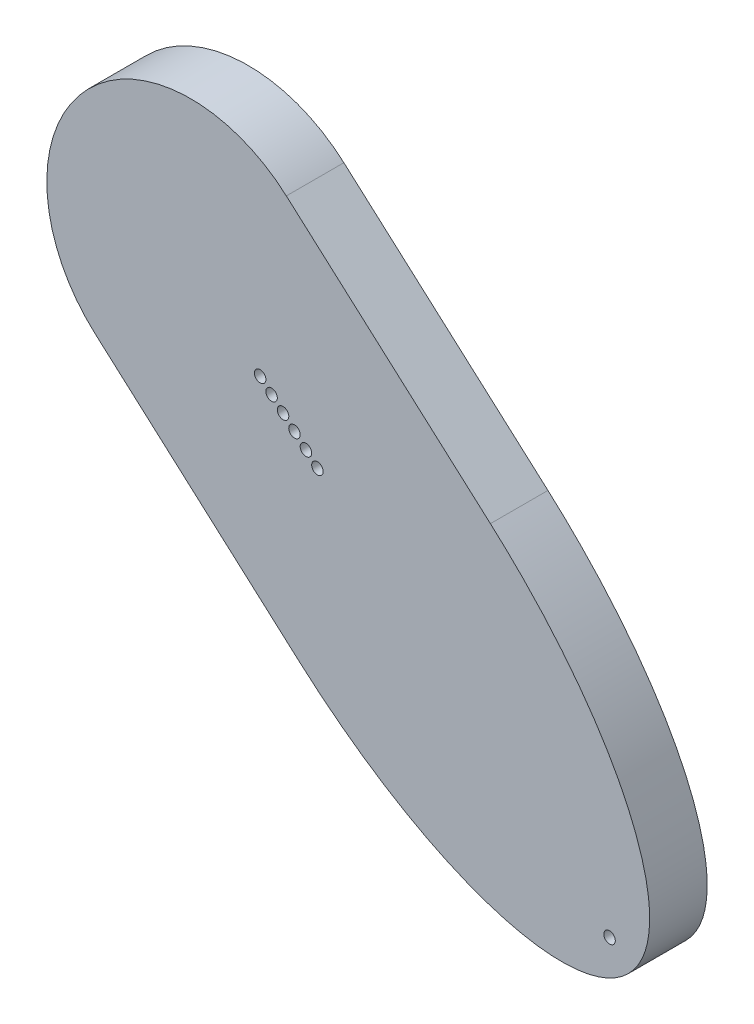
ISO-10303-21;
HEADER;
FILE_DESCRIPTION(('STEP AP214'),'2;1');
FILE_NAME('part.step','',(''),(''),'','','');
FILE_SCHEMA(('AUTOMOTIVE_DESIGN { 1 0 10303 214 1 1 1 1 }'));
ENDSEC;
DATA;
#1=APPLICATION_CONTEXT('core data for automotive mechanical design processes');
#2=APPLICATION_PROTOCOL_DEFINITION('international standard','automotive_design',2000,#1);
#3=PRODUCT_CONTEXT('',#1,'mechanical');
#4=PRODUCT('Part','Part','',(#3));
#5=PRODUCT_RELATED_PRODUCT_CATEGORY('part','',(#4));
#6=PRODUCT_DEFINITION_FORMATION('','',#4);
#7=PRODUCT_DEFINITION_CONTEXT('part definition',#1,'design');
#8=PRODUCT_DEFINITION('design','',#6,#7);
#9=PRODUCT_DEFINITION_SHAPE('','',#8);
#10=(LENGTH_UNIT() NAMED_UNIT(*) SI_UNIT(.MILLI.,.METRE.));
#11=(NAMED_UNIT(*) PLANE_ANGLE_UNIT() SI_UNIT($,.RADIAN.));
#12=(NAMED_UNIT(*) SI_UNIT($,.STERADIAN.) SOLID_ANGLE_UNIT());
#13=UNCERTAINTY_MEASURE_WITH_UNIT(LENGTH_MEASURE(1.E-05),#10,'distance_accuracy_value','');
#14=(GEOMETRIC_REPRESENTATION_CONTEXT(3) GLOBAL_UNCERTAINTY_ASSIGNED_CONTEXT((#13)) GLOBAL_UNIT_ASSIGNED_CONTEXT((#10,
#11,#12)) REPRESENTATION_CONTEXT('',''));
#15=CARTESIAN_POINT('',(0.,0.,0.));
#16=DIRECTION('',(0.,0.,1.));
#17=DIRECTION('',(1.,0.,0.));
#18=AXIS2_PLACEMENT_3D('',#15,#16,#17);
#19=CARTESIAN_POINT('',(0.,0.,-20.));
#20=DIRECTION('',(0.,0.,1.));
#21=DIRECTION('',(1.,0.,0.));
#22=AXIS2_PLACEMENT_3D('',#19,#20,#21);
#23=PLANE('',#22);
#24=CARTESIAN_POINT('',(16.0543335775935,-14.3004920680847,-20.));
#25=DIRECTION('',(0.,0.,-1.));
#26=DIRECTION('',(-1.,0.,0.));
#27=AXIS2_PLACEMENT_3D('',#24,#25,#26);
#28=CIRCLE('',#27,0.999999999999997);
#29=CARTESIAN_POINT('',(15.0543335775935,-14.3004920680847,-20.));
#30=VERTEX_POINT('',#29);
#31=EDGE_CURVE('E721',#30,#30,#28,.T.);
#32=ORIENTED_EDGE('',*,*,#31,.F.);
#33=EDGE_LOOP('',(#32));
#34=FACE_BOUND('',#33,.T.);
#35=CARTESIAN_POINT('',(18.0456029021656,-16.074226931873,-20.));
#36=DIRECTION('',(0.,0.,-1.));
#37=DIRECTION('',(-1.,0.,0.));
#38=AXIS2_PLACEMENT_3D('',#35,#36,#37);
#39=CIRCLE('',#38,0.999999999999998);
#40=CARTESIAN_POINT('',(17.0456029021656,-16.074226931873,-20.));
#41=VERTEX_POINT('',#40);
#42=EDGE_CURVE('E732',#41,#41,#39,.T.);
#43=ORIENTED_EDGE('',*,*,#42,.F.);
#44=EDGE_LOOP('',(#43));
#45=FACE_BOUND('',#44,.T.);
#46=CARTESIAN_POINT('',(22.0281415513099,-19.6216966594495,-20.));
#47=DIRECTION('',(0.,0.,-1.));
#48=DIRECTION('',(-1.,0.,0.));
#49=AXIS2_PLACEMENT_3D('',#46,#47,#48);
#50=CIRCLE('',#49,1.);
#51=CARTESIAN_POINT('',(21.0281415513099,-19.6216966594495,-20.));
#52=VERTEX_POINT('',#51);
#53=EDGE_CURVE('E509',#52,#52,#50,.T.);
#54=ORIENTED_EDGE('',*,*,#53,.F.);
#55=EDGE_LOOP('',(#54));
#56=FACE_BOUND('',#55,.T.);
#57=CARTESIAN_POINT('',(12.0717949284492,-10.7530223405082,-20.));
#58=DIRECTION('',(0.,0.,-1.));
#59=DIRECTION('',(-1.,0.,0.));
#60=AXIS2_PLACEMENT_3D('',#57,#58,#59);
#61=CIRCLE('',#60,0.999999999999994);
#62=CARTESIAN_POINT('',(11.0717949284492,-10.7530223405082,-20.));
#63=VERTEX_POINT('',#62);
#64=EDGE_CURVE('E723',#63,#63,#61,.T.);
#65=ORIENTED_EDGE('',*,*,#64,.F.);
#66=EDGE_LOOP('',(#65));
#67=FACE_BOUND('',#66,.T.);
#68=CARTESIAN_POINT('',(20.0368722267378,-17.8479617956613,-20.));
#69=DIRECTION('',(0.,0.,-1.));
#70=DIRECTION('',(-1.,0.,0.));
#71=AXIS2_PLACEMENT_3D('',#68,#69,#70);
#72=CIRCLE('',#71,1.);
#73=CARTESIAN_POINT('',(19.0368722267378,-17.8479617956613,-20.));
#74=VERTEX_POINT('',#73);
#75=EDGE_CURVE('E506',#74,#74,#72,.T.);
#76=ORIENTED_EDGE('',*,*,#75,.F.);
#77=EDGE_LOOP('',(#76));
#78=FACE_BOUND('',#77,.T.);
#79=DIRECTION('',(-0.683430900894076,0.730015207857419,0.));
#80=VECTOR('',#79,1.);
#81=CARTESIAN_POINT('',(5.08912030286319,4.76436933903359,-20.));
#82=LINE('',#81,#80);
#83=CARTESIAN_POINT('',(23.527848394188,-14.9311871577616,-20.));
#84=VERTEX_POINT('',#83);
#85=CARTESIAN_POINT('',(14.1661952154149,-4.93142100400631,-20.));
#86=VERTEX_POINT('',#85);
#87=EDGE_CURVE('E429',#84,#86,#82,.T.);
#88=ORIENTED_EDGE('',*,*,#87,.F.);
#89=CARTESIAN_POINT('',(20.5347082257974,-18.2914121401648,-20.));
#90=DIRECTION('',(0.,0.,-1.));
#91=DIRECTION('',(-1.,0.,0.));
#92=AXIS2_PLACEMENT_3D('',#89,#90,#91);
#93=CIRCLE('',#92,4.5);
#94=CARTESIAN_POINT('',(17.5415680574068,-21.651637122568,-20.));
#95=VERTEX_POINT('',#94);
#96=EDGE_CURVE('E423',#84,#95,#93,.T.);
#97=ORIENTED_EDGE('',*,*,#96,.T.);
#98=DIRECTION('',(0.803869202296331,-0.594806107567383,0.));
#99=VECTOR('',#98,1.);
#100=CARTESIAN_POINT('',(-4.14654353184298,-5.6039751421887,-20.));
#101=LINE('',#100,#99);
#102=CARTESIAN_POINT('',(6.53014808334627,-13.5039685281612,-20.));
#103=VERTEX_POINT('',#102);
#104=EDGE_CURVE('E281',#103,#95,#101,.T.);
#105=ORIENTED_EDGE('',*,*,#104,.F.);
#106=CARTESIAN_POINT('',(0.,0.,-20.));
#107=DIRECTION('',(0.,0.,-1.));
#108=DIRECTION('',(-1.,0.,0.));
#109=AXIS2_PLACEMENT_3D('',#106,#107,#108);
#110=CIRCLE('',#109,15.);
#111=CARTESIAN_POINT('',(6.27996634254836,-13.6221152078691,-20.));
#112=VERTEX_POINT('',#111);
#113=EDGE_CURVE('E445',#103,#112,#110,.T.);
#114=ORIENTED_EDGE('',*,*,#113,.T.);
#115=CARTESIAN_POINT('',(20.5347082257974,-18.2914121401648,-20.));
#116=DIRECTION('',(0.,0.,-1.));
#117=DIRECTION('',(-1.,0.,0.));
#118=AXIS2_PLACEMENT_3D('',#115,#116,#117);
#119=CIRCLE('',#118,15.);
#120=CARTESIAN_POINT('',(6.36177647907124,-13.3793855011245,-20.));
#121=VERTEX_POINT('',#120);
#122=EDGE_CURVE('E443',#112,#121,#119,.T.);
#123=ORIENTED_EDGE('',*,*,#122,.T.);
#124=DIRECTION('',(0.803869202296331,-0.594806107567383,0.));
#125=VECTOR('',#124,1.);
#126=CARTESIAN_POINT('',(-4.14654353184298,-5.6039751421887,-20.));
#127=LINE('',#126,#125);
#128=CARTESIAN_POINT('',(-3.63709124618949,-5.9809336450835,-20.));
#129=VERTEX_POINT('',#128);
#130=EDGE_CURVE('E440',#129,#121,#127,.T.);
#131=ORIENTED_EDGE('',*,*,#130,.F.);
#132=CARTESIAN_POINT('',(0.,0.,-20.));
#133=DIRECTION('',(0.,0.,-1.));
#134=DIRECTION('',(-1.,0.,0.));
#135=AXIS2_PLACEMENT_3D('',#132,#133,#134);
#136=CIRCLE('',#135,7.);
#137=CARTESIAN_POINT('',(5.5222447882299,4.30172203877328,-20.));
#138=VERTEX_POINT('',#137);
#139=EDGE_CURVE('E438',#129,#138,#136,.T.);
#140=ORIENTED_EDGE('',*,*,#139,.T.);
#141=DIRECTION('',(-0.683430900894076,0.730015207857419,0.));
#142=VECTOR('',#141,1.);
#143=CARTESIAN_POINT('',(5.08912030286319,4.76436933903359,-20.));
#144=LINE('',#143,#142);
#145=CARTESIAN_POINT('',(14.0230495931347,-4.77851822910088,-20.));
#146=VERTEX_POINT('',#145);
#147=EDGE_CURVE('E435',#146,#138,#144,.T.);
#148=ORIENTED_EDGE('',*,*,#147,.F.);
#149=CARTESIAN_POINT('',(20.5347082257974,-18.2914121401648,-20.));
#150=DIRECTION('',(0.,0.,-1.));
#151=DIRECTION('',(-1.,0.,0.));
#152=AXIS2_PLACEMENT_3D('',#149,#150,#151);
#153=CIRCLE('',#152,15.);
#154=CARTESIAN_POINT('',(14.254741883249,-4.66929693229568,-20.));
#155=VERTEX_POINT('',#154);
#156=EDGE_CURVE('E433',#146,#155,#153,.T.);
#157=ORIENTED_EDGE('',*,*,#156,.T.);
#158=CARTESIAN_POINT('',(0.,0.,-20.));
#159=DIRECTION('',(0.,0.,-1.));
#160=DIRECTION('',(-1.,0.,0.));
#161=AXIS2_PLACEMENT_3D('',#158,#159,#160);
#162=CIRCLE('',#161,15.);
#163=EDGE_CURVE('E431',#155,#86,#162,.T.);
#164=ORIENTED_EDGE('',*,*,#163,.T.);
#165=EDGE_LOOP('',(#88,#97,#105,#114,#123,#131,#140,#148,#157,#164));
#166=FACE_BOUND('',#165,.T.);
#167=CARTESIAN_POINT('',(14.0630642530214,-12.5267572042964,-20.));
#168=DIRECTION('',(0.,0.,-1.));
#169=DIRECTION('',(-1.,0.,0.));
#170=AXIS2_PLACEMENT_3D('',#167,#168,#169);
#171=CIRCLE('',#170,0.999999999999995);
#172=CARTESIAN_POINT('',(13.0630642530214,-12.5267572042964,-20.));
#173=VERTEX_POINT('',#172);
#174=EDGE_CURVE('E719',#173,#173,#171,.T.);
#175=ORIENTED_EDGE('',*,*,#174,.F.);
#176=EDGE_LOOP('',(#175));
#177=FACE_BOUND('',#176,.T.);
#178=ADVANCED_FACE('F135',(#34,#45,#56,#67,#78,#166,#177),#23,.F.);
#179=CARTESIAN_POINT('',(35.4690414809228,-31.594257333012,-20.));
#180=DIRECTION('',(0.,0.,1.));
#181=DIRECTION('',(-0.746716662756269,0.665142259642357,0.));
#182=AXIS2_PLACEMENT_3D('',#179,#180,#181);
#183=ELLIPSE('',#182,55.,25.);
#184=CARTESIAN_POINT('',(18.8404849898639,-50.2621739019187,-20.));
#185=VERTEX_POINT('',#184);
#186=CARTESIAN_POINT('',(52.0975979719817,-12.9263407641053,-20.));
#187=VERTEX_POINT('',#186);
#188=EDGE_CURVE('E297',#185,#187,#183,.T.);
#189=ORIENTED_EDGE('',*,*,#188,.F.);
#190=DIRECTION('',(0.746716662756269,-0.665142259642357,0.));
#191=VECTOR('',#190,1.);
#192=CARTESIAN_POINT('',(-16.6285564910589,-18.6679165689067,-20.));
#193=LINE('',#192,#191);
#194=CARTESIAN_POINT('',(-16.6285564910589,-18.6679165689067,-20.));
#195=VERTEX_POINT('',#194);
#196=EDGE_CURVE('E389',#195,#185,#193,.T.);
#197=ORIENTED_EDGE('',*,*,#196,.F.);
#198=CARTESIAN_POINT('',(0.,0.,-20.));
#199=DIRECTION('',(0.,0.,1.));
#200=DIRECTION('',(1.,0.,0.));
#201=AXIS2_PLACEMENT_3D('',#198,#199,#200);
#202=CIRCLE('',#201,25.);
#203=CARTESIAN_POINT('',(16.6285564910589,18.6679165689067,-20.));
#204=VERTEX_POINT('',#203);
#205=EDGE_CURVE('E386',#204,#195,#202,.T.);
#206=ORIENTED_EDGE('',*,*,#205,.F.);
#207=DIRECTION('',(0.746716662756268,-0.665142259642358,0.));
#208=VECTOR('',#207,1.);
#209=CARTESIAN_POINT('',(16.6285564910589,18.6679165689067,-20.));
#210=LINE('',#209,#208);
#211=EDGE_CURVE('E394',#204,#187,#210,.T.);
#212=ORIENTED_EDGE('',*,*,#211,.T.);
#213=EDGE_LOOP('',(#189,#197,#206,#212));
#214=FACE_BOUND('',#213,.T.);
#215=CARTESIAN_POINT('',(72.8048746187362,-64.8513703151298,-20.));
#216=DIRECTION('',(0.,0.,1.));
#217=DIRECTION('',(1.,0.,0.));
#218=AXIS2_PLACEMENT_3D('',#215,#216,#217);
#219=CIRCLE('',#218,1.00000000000001);
#220=CARTESIAN_POINT('',(73.8048746187362,-64.8513703151298,-20.));
#221=VERTEX_POINT('',#220);
#222=EDGE_CURVE('E12',#221,#221,#219,.T.);
#223=ORIENTED_EDGE('',*,*,#222,.T.);
#224=EDGE_LOOP('',(#223));
#225=FACE_BOUND('',#224,.T.);
#226=DIRECTION('',(-0.746716662756269,0.665142259642357,0.));
#227=VECTOR('',#226,1.);
#228=CARTESIAN_POINT('',(-9.97713389463536,-11.200749941344,-20.));
#229=LINE('',#228,#227);
#230=CARTESIAN_POINT('',(10.557574331162,-29.4921620815089,-20.));
#231=VERTEX_POINT('',#230);
#232=CARTESIAN_POINT('',(-9.97713389463536,-11.200749941344,-20.));
#233=VERTEX_POINT('',#232);
#234=EDGE_CURVE('E284',#231,#233,#229,.T.);
#235=ORIENTED_EDGE('',*,*,#234,.F.);
#236=CARTESIAN_POINT('',(20.5347082257974,-18.2914121401648,-20.));
#237=DIRECTION('',(0.,0.,-1.));
#238=DIRECTION('',(-1.,0.,0.));
#239=AXIS2_PLACEMENT_3D('',#236,#237,#238);
#240=CIRCLE('',#239,15.);
#241=CARTESIAN_POINT('',(30.5118421204327,-7.09066219882079,-20.));
#242=VERTEX_POINT('',#241);
#243=EDGE_CURVE('E419',#242,#231,#240,.T.);
#244=ORIENTED_EDGE('',*,*,#243,.F.);
#245=DIRECTION('',(-0.746716662756269,0.665142259642357,0.));
#246=VECTOR('',#245,1.);
#247=CARTESIAN_POINT('',(9.97713389463537,11.200749941344,-20.));
#248=LINE('',#247,#246);
#249=CARTESIAN_POINT('',(9.97713389463537,11.200749941344,-20.));
#250=VERTEX_POINT('',#249);
#251=EDGE_CURVE('E157',#242,#250,#248,.T.);
#252=ORIENTED_EDGE('',*,*,#251,.T.);
#253=CARTESIAN_POINT('',(0.,0.,-20.));
#254=DIRECTION('',(0.,0.,-1.));
#255=DIRECTION('',(-1.,0.,0.));
#256=AXIS2_PLACEMENT_3D('',#253,#254,#255);
#257=CIRCLE('',#256,15.);
#258=EDGE_CURVE('E152',#233,#250,#257,.T.);
#259=ORIENTED_EDGE('',*,*,#258,.F.);
#260=EDGE_LOOP('',(#235,#244,#252,#259));
#261=FACE_BOUND('',#260,.T.);
#262=ADVANCED_FACE('F329',(#214,#225,#261),#23,.F.);
#263=CARTESIAN_POINT('',(0.,0.,-10.));
#264=DIRECTION('',(0.,0.,1.));
#265=DIRECTION('',(1.,0.,0.));
#266=AXIS2_PLACEMENT_3D('',#263,#264,#265);
#267=PLANE('',#266);
#268=CARTESIAN_POINT('',(16.0543335775935,-14.3004920680847,-10.));
#269=DIRECTION('',(0.,0.,-1.));
#270=DIRECTION('',(-1.,0.,0.));
#271=AXIS2_PLACEMENT_3D('',#268,#269,#270);
#272=CIRCLE('',#271,0.999999999999997);
#273=CARTESIAN_POINT('',(15.0543335775935,-14.3004920680847,-10.));
#274=VERTEX_POINT('',#273);
#275=EDGE_CURVE('E347',#274,#274,#272,.T.);
#276=ORIENTED_EDGE('',*,*,#275,.T.);
#277=EDGE_LOOP('',(#276));
#278=FACE_BOUND('',#277,.T.);
#279=CARTESIAN_POINT('',(14.0630642530214,-12.5267572042964,-10.));
#280=DIRECTION('',(0.,0.,-1.));
#281=DIRECTION('',(-1.,0.,0.));
#282=AXIS2_PLACEMENT_3D('',#279,#280,#281);
#283=CIRCLE('',#282,0.999999999999995);
#284=CARTESIAN_POINT('',(13.0630642530214,-12.5267572042964,-10.));
#285=VERTEX_POINT('',#284);
#286=EDGE_CURVE('E351',#285,#285,#283,.T.);
#287=ORIENTED_EDGE('',*,*,#286,.T.);
#288=EDGE_LOOP('',(#287));
#289=FACE_BOUND('',#288,.T.);
#290=CARTESIAN_POINT('',(18.0456029021656,-16.074226931873,-10.));
#291=DIRECTION('',(0.,0.,-1.));
#292=DIRECTION('',(-1.,0.,0.));
#293=AXIS2_PLACEMENT_3D('',#290,#291,#292);
#294=CIRCLE('',#293,0.999999999999998);
#295=CARTESIAN_POINT('',(17.0456029021656,-16.074226931873,-10.));
#296=VERTEX_POINT('',#295);
#297=EDGE_CURVE('E355',#296,#296,#294,.T.);
#298=ORIENTED_EDGE('',*,*,#297,.T.);
#299=EDGE_LOOP('',(#298));
#300=FACE_BOUND('',#299,.T.);
#301=CARTESIAN_POINT('',(22.0281415513099,-19.6216966594495,-10.));
#302=DIRECTION('',(0.,0.,-1.));
#303=DIRECTION('',(-1.,0.,0.));
#304=AXIS2_PLACEMENT_3D('',#301,#302,#303);
#305=CIRCLE('',#304,1.);
#306=CARTESIAN_POINT('',(21.0281415513099,-19.6216966594495,-10.));
#307=VERTEX_POINT('',#306);
#308=EDGE_CURVE('E359',#307,#307,#305,.T.);
#309=ORIENTED_EDGE('',*,*,#308,.T.);
#310=EDGE_LOOP('',(#309));
#311=FACE_BOUND('',#310,.T.);
#312=CARTESIAN_POINT('',(12.0717949284492,-10.7530223405082,-10.));
#313=DIRECTION('',(0.,0.,-1.));
#314=DIRECTION('',(-1.,0.,0.));
#315=AXIS2_PLACEMENT_3D('',#312,#313,#314);
#316=CIRCLE('',#315,0.999999999999994);
#317=CARTESIAN_POINT('',(11.0717949284492,-10.7530223405082,-10.));
#318=VERTEX_POINT('',#317);
#319=EDGE_CURVE('E363',#318,#318,#316,.T.);
#320=ORIENTED_EDGE('',*,*,#319,.T.);
#321=EDGE_LOOP('',(#320));
#322=FACE_BOUND('',#321,.T.);
#323=CARTESIAN_POINT('',(20.0368722267378,-17.8479617956613,-10.));
#324=DIRECTION('',(0.,0.,-1.));
#325=DIRECTION('',(-1.,0.,0.));
#326=AXIS2_PLACEMENT_3D('',#323,#324,#325);
#327=CIRCLE('',#326,1.);
#328=CARTESIAN_POINT('',(19.0368722267378,-17.8479617956613,-10.));
#329=VERTEX_POINT('',#328);
#330=EDGE_CURVE('E367',#329,#329,#327,.T.);
#331=ORIENTED_EDGE('',*,*,#330,.T.);
#332=EDGE_LOOP('',(#331));
#333=FACE_BOUND('',#332,.T.);
#334=CARTESIAN_POINT('',(35.4690414809228,-31.594257333012,-10.));
#335=DIRECTION('',(0.,0.,1.));
#336=DIRECTION('',(-0.746716662756269,0.665142259642357,0.));
#337=AXIS2_PLACEMENT_3D('',#334,#335,#336);
#338=ELLIPSE('',#337,55.,25.);
#339=CARTESIAN_POINT('',(18.8404849898639,-50.2621739019187,-10.));
#340=VERTEX_POINT('',#339);
#341=CARTESIAN_POINT('',(52.0975979719817,-12.9263407641053,-10.));
#342=VERTEX_POINT('',#341);
#343=EDGE_CURVE('E301',#340,#342,#338,.T.);
#344=ORIENTED_EDGE('',*,*,#343,.T.);
#345=DIRECTION('',(0.746716662756268,-0.665142259642358,0.));
#346=VECTOR('',#345,1.);
#347=CARTESIAN_POINT('',(16.6285564910589,18.6679165689067,-10.));
#348=LINE('',#347,#346);
#349=CARTESIAN_POINT('',(16.6285564910589,18.6679165689067,-10.));
#350=VERTEX_POINT('',#349);
#351=EDGE_CURVE('E377',#350,#342,#348,.T.);
#352=ORIENTED_EDGE('',*,*,#351,.F.);
#353=CARTESIAN_POINT('',(0.,0.,-10.));
#354=DIRECTION('',(0.,0.,1.));
#355=DIRECTION('',(1.,0.,0.));
#356=AXIS2_PLACEMENT_3D('',#353,#354,#355);
#357=CIRCLE('',#356,25.);
#358=CARTESIAN_POINT('',(-16.6285564910589,-18.6679165689067,-10.));
#359=VERTEX_POINT('',#358);
#360=EDGE_CURVE('E391',#350,#359,#357,.T.);
#361=ORIENTED_EDGE('',*,*,#360,.T.);
#362=DIRECTION('',(0.746716662756269,-0.665142259642357,0.));
#363=VECTOR('',#362,1.);
#364=CARTESIAN_POINT('',(-16.6285564910589,-18.6679165689067,-10.));
#365=LINE('',#364,#363);
#366=EDGE_CURVE('E379',#359,#340,#365,.T.);
#367=ORIENTED_EDGE('',*,*,#366,.T.);
#368=EDGE_LOOP('',(#344,#352,#361,#367));
#369=FACE_BOUND('',#368,.T.);
#370=CARTESIAN_POINT('',(72.8048746187362,-64.8513703151298,-10.));
#371=DIRECTION('',(0.,0.,1.));
#372=DIRECTION('',(1.,0.,0.));
#373=AXIS2_PLACEMENT_3D('',#370,#371,#372);
#374=CIRCLE('',#373,1.00000000000001);
#375=CARTESIAN_POINT('',(73.8048746187362,-64.8513703151298,-10.));
#376=VERTEX_POINT('',#375);
#377=EDGE_CURVE('E144',#376,#376,#374,.T.);
#378=ORIENTED_EDGE('',*,*,#377,.F.);
#379=EDGE_LOOP('',(#378));
#380=FACE_BOUND('',#379,.T.);
#381=ADVANCED_FACE('F309',(#278,#289,#300,#311,#322,#333,#369,#380),#267,.T.);
#382=DIRECTION('',(0.,0.,1.));
#383=VECTOR('',#382,1.);
#384=SURFACE_OF_LINEAR_EXTRUSION('',#183,#383);
#385=DIRECTION('',(0.,0.,1.));
#386=VECTOR('',#385,1.);
#387=CARTESIAN_POINT('',(52.0975979719817,-12.9263407641053,-20.));
#388=LINE('',#387,#386);
#389=EDGE_CURVE('E296',#187,#342,#388,.T.);
#390=ORIENTED_EDGE('',*,*,#389,.T.);
#391=ORIENTED_EDGE('',*,*,#343,.F.);
#392=DIRECTION('',(0.,0.,1.));
#393=VECTOR('',#392,1.);
#394=CARTESIAN_POINT('',(18.8404849898639,-50.2621739019188,-20.));
#395=LINE('',#394,#393);
#396=EDGE_CURVE('E300',#185,#340,#395,.T.);
#397=ORIENTED_EDGE('',*,*,#396,.F.);
#398=ORIENTED_EDGE('',*,*,#188,.T.);
#399=EDGE_LOOP('',(#390,#391,#397,#398));
#400=FACE_BOUND('',#399,.T.);
#401=ADVANCED_FACE('F304',(#400),#384,.T.);
#402=CARTESIAN_POINT('',(72.8048746187362,-64.8513703151298,-20.));
#403=DIRECTION('',(0.,0.,1.));
#404=DIRECTION('',(1.,0.,0.));
#405=AXIS2_PLACEMENT_3D('',#402,#403,#404);
#406=CYLINDRICAL_SURFACE('',#405,1.00000000000001);
#407=ORIENTED_EDGE('',*,*,#222,.F.);
#408=EDGE_LOOP('',(#407));
#409=FACE_BOUND('',#408,.T.);
#410=ORIENTED_EDGE('',*,*,#377,.T.);
#411=EDGE_LOOP('',(#410));
#412=FACE_BOUND('',#411,.T.);
#413=ADVANCED_FACE('F308',(#409,#412),#406,.F.);
#414=CARTESIAN_POINT('',(0.,0.,-20.));
#415=DIRECTION('',(0.,0.,1.));
#416=DIRECTION('',(1.,0.,0.));
#417=AXIS2_PLACEMENT_3D('',#414,#415,#416);
#418=CYLINDRICAL_SURFACE('',#417,25.);
#419=ORIENTED_EDGE('',*,*,#360,.F.);
#420=DIRECTION('',(0.,0.,1.));
#421=VECTOR('',#420,1.);
#422=CARTESIAN_POINT('',(16.6285564910589,18.6679165689067,-20.));
#423=LINE('',#422,#421);
#424=EDGE_CURVE('E380',#204,#350,#423,.T.);
#425=ORIENTED_EDGE('',*,*,#424,.F.);
#426=ORIENTED_EDGE('',*,*,#205,.T.);
#427=DIRECTION('',(0.,0.,1.));
#428=VECTOR('',#427,1.);
#429=CARTESIAN_POINT('',(-16.6285564910589,-18.6679165689067,-20.));
#430=LINE('',#429,#428);
#431=EDGE_CURVE('E139',#195,#359,#430,.T.);
#432=ORIENTED_EDGE('',*,*,#431,.T.);
#433=EDGE_LOOP('',(#419,#425,#426,#432));
#434=FACE_BOUND('',#433,.T.);
#435=ADVANCED_FACE('F137',(#434),#418,.T.);
#436=CARTESIAN_POINT('',(16.6285564910589,18.6679165689067,-20.));
#437=DIRECTION('',(-0.665142259642358,-0.746716662756268,0.));
#438=DIRECTION('',(0.746716662756268,-0.665142259642358,0.));
#439=AXIS2_PLACEMENT_3D('',#436,#437,#438);
#440=PLANE('',#439);
#441=ORIENTED_EDGE('',*,*,#351,.T.);
#442=ORIENTED_EDGE('',*,*,#389,.F.);
#443=ORIENTED_EDGE('',*,*,#211,.F.);
#444=ORIENTED_EDGE('',*,*,#424,.T.);
#445=EDGE_LOOP('',(#441,#442,#443,#444));
#446=FACE_BOUND('',#445,.T.);
#447=ADVANCED_FACE('F313',(#446),#440,.F.);
#448=CARTESIAN_POINT('',(-16.6285564910589,-18.6679165689067,-20.));
#449=DIRECTION('',(-0.665142259642357,-0.746716662756269,0.));
#450=DIRECTION('',(0.746716662756269,-0.665142259642357,0.));
#451=AXIS2_PLACEMENT_3D('',#448,#449,#450);
#452=PLANE('',#451);
#453=ORIENTED_EDGE('',*,*,#366,.F.);
#454=ORIENTED_EDGE('',*,*,#431,.F.);
#455=ORIENTED_EDGE('',*,*,#196,.T.);
#456=ORIENTED_EDGE('',*,*,#396,.T.);
#457=EDGE_LOOP('',(#453,#454,#455,#456));
#458=FACE_BOUND('',#457,.T.);
#459=ADVANCED_FACE('F315',(#458),#452,.T.);
#460=CARTESIAN_POINT('',(20.5347082257974,-18.2914121401648,-24.));
#461=DIRECTION('',(0.,0.,1.));
#462=DIRECTION('',(1.,0.,0.));
#463=AXIS2_PLACEMENT_3D('',#460,#461,#462);
#464=CYLINDRICAL_SURFACE('',#463,4.5);
#465=ORIENTED_EDGE('',*,*,#96,.F.);
#466=DIRECTION('',(0.,0.,1.));
#467=VECTOR('',#466,1.);
#468=CARTESIAN_POINT('',(23.527848394188,-14.9311871577616,-24.));
#469=LINE('',#468,#467);
#470=CARTESIAN_POINT('',(23.527848394188,-14.9311871577616,-24.));
#471=VERTEX_POINT('',#470);
#472=EDGE_CURVE('E400',#471,#84,#469,.T.);
#473=ORIENTED_EDGE('',*,*,#472,.F.);
#474=CARTESIAN_POINT('',(20.5347082257974,-18.2914121401648,-24.));
#475=DIRECTION('',(0.,0.,-1.));
#476=DIRECTION('',(-1.,0.,0.));
#477=AXIS2_PLACEMENT_3D('',#474,#475,#476);
#478=CIRCLE('',#477,4.5);
#479=CARTESIAN_POINT('',(17.5415680574068,-21.651637122568,-24.));
#480=VERTEX_POINT('',#479);
#481=EDGE_CURVE('E516',#471,#480,#478,.T.);
#482=ORIENTED_EDGE('',*,*,#481,.T.);
#483=DIRECTION('',(0.,0.,1.));
#484=VECTOR('',#483,1.);
#485=CARTESIAN_POINT('',(17.5415680574068,-21.651637122568,-24.));
#486=LINE('',#485,#484);
#487=EDGE_CURVE('E285',#480,#95,#486,.T.);
#488=ORIENTED_EDGE('',*,*,#487,.T.);
#489=EDGE_LOOP('',(#465,#473,#482,#488));
#490=FACE_BOUND('',#489,.T.);
#491=ADVANCED_FACE('F311',(#490),#464,.F.);
#492=CARTESIAN_POINT('',(5.08912030286319,4.76436933903359,-24.));
#493=DIRECTION('',(0.730015207857419,0.683430900894076,0.));
#494=DIRECTION('',(-0.683430900894076,0.730015207857419,0.));
#495=AXIS2_PLACEMENT_3D('',#492,#493,#494);
#496=PLANE('',#495);
#497=ORIENTED_EDGE('',*,*,#87,.T.);
#498=DIRECTION('',(0.,0.,1.));
#499=VECTOR('',#498,1.);
#500=CARTESIAN_POINT('',(14.166195215415,-4.93142100400631,-24.));
#501=LINE('',#500,#499);
#502=CARTESIAN_POINT('',(14.166195215415,-4.93142100400631,-24.));
#503=VERTEX_POINT('',#502);
#504=EDGE_CURVE('E402',#503,#86,#501,.T.);
#505=ORIENTED_EDGE('',*,*,#504,.F.);
#506=DIRECTION('',(-0.683430900894076,0.730015207857419,0.));
#507=VECTOR('',#506,1.);
#508=CARTESIAN_POINT('',(5.08912030286319,4.76436933903359,-24.));
#509=LINE('',#508,#507);
#510=EDGE_CURVE('E493',#471,#503,#509,.T.);
#511=ORIENTED_EDGE('',*,*,#510,.F.);
#512=ORIENTED_EDGE('',*,*,#472,.T.);
#513=EDGE_LOOP('',(#497,#505,#511,#512));
#514=FACE_BOUND('',#513,.T.);
#515=ADVANCED_FACE('F322',(#514),#496,.F.);
#516=CARTESIAN_POINT('',(0.,0.,-24.));
#517=DIRECTION('',(0.,0.,1.));
#518=DIRECTION('',(1.,0.,0.));
#519=AXIS2_PLACEMENT_3D('',#516,#517,#518);
#520=CYLINDRICAL_SURFACE('',#519,15.);
#521=ORIENTED_EDGE('',*,*,#163,.F.);
#522=DIRECTION('',(0.,0.,1.));
#523=VECTOR('',#522,1.);
#524=CARTESIAN_POINT('',(14.254741883249,-4.66929693229568,-24.));
#525=LINE('',#524,#523);
#526=CARTESIAN_POINT('',(14.254741883249,-4.66929693229568,-24.));
#527=VERTEX_POINT('',#526);
#528=EDGE_CURVE('E409',#527,#155,#525,.T.);
#529=ORIENTED_EDGE('',*,*,#528,.F.);
#530=CARTESIAN_POINT('',(0.,0.,-24.));
#531=DIRECTION('',(0.,0.,-1.));
#532=DIRECTION('',(-1.,0.,0.));
#533=AXIS2_PLACEMENT_3D('',#530,#531,#532);
#534=CIRCLE('',#533,15.);
#535=EDGE_CURVE('E491',#527,#503,#534,.T.);
#536=ORIENTED_EDGE('',*,*,#535,.T.);
#537=ORIENTED_EDGE('',*,*,#504,.T.);
#538=EDGE_LOOP('',(#521,#529,#536,#537));
#539=FACE_BOUND('',#538,.T.);
#540=ADVANCED_FACE('F476',(#539),#520,.F.);
#541=CARTESIAN_POINT('',(20.5347082257974,-18.2914121401648,-24.));
#542=DIRECTION('',(0.,0.,1.));
#543=DIRECTION('',(1.,0.,0.));
#544=AXIS2_PLACEMENT_3D('',#541,#542,#543);
#545=CYLINDRICAL_SURFACE('',#544,15.);
#546=ORIENTED_EDGE('',*,*,#156,.F.);
#547=DIRECTION('',(0.,0.,1.));
#548=VECTOR('',#547,1.);
#549=CARTESIAN_POINT('',(14.0230495931347,-4.77851822910088,-24.));
#550=LINE('',#549,#548);
#551=CARTESIAN_POINT('',(14.0230495931347,-4.77851822910088,-24.));
#552=VERTEX_POINT('',#551);
#553=EDGE_CURVE('E463',#552,#146,#550,.T.);
#554=ORIENTED_EDGE('',*,*,#553,.F.);
#555=CARTESIAN_POINT('',(20.5347082257974,-18.2914121401648,-24.));
#556=DIRECTION('',(0.,0.,-1.));
#557=DIRECTION('',(-1.,0.,0.));
#558=AXIS2_PLACEMENT_3D('',#555,#556,#557);
#559=CIRCLE('',#558,15.);
#560=EDGE_CURVE('E472',#552,#527,#559,.T.);
#561=ORIENTED_EDGE('',*,*,#560,.T.);
#562=ORIENTED_EDGE('',*,*,#528,.T.);
#563=EDGE_LOOP('',(#546,#554,#561,#562));
#564=FACE_BOUND('',#563,.T.);
#565=ADVANCED_FACE('F470',(#564),#545,.F.);
#566=CARTESIAN_POINT('',(5.08912030286319,4.76436933903359,-24.));
#567=DIRECTION('',(0.730015207857419,0.683430900894076,0.));
#568=DIRECTION('',(-0.683430900894076,0.730015207857419,0.));
#569=AXIS2_PLACEMENT_3D('',#566,#567,#568);
#570=PLANE('',#569);
#571=ORIENTED_EDGE('',*,*,#147,.T.);
#572=DIRECTION('',(0.,0.,1.));
#573=VECTOR('',#572,1.);
#574=CARTESIAN_POINT('',(5.5222447882299,4.30172203877328,-24.));
#575=LINE('',#574,#573);
#576=CARTESIAN_POINT('',(5.5222447882299,4.30172203877328,-24.));
#577=VERTEX_POINT('',#576);
#578=EDGE_CURVE('E460',#577,#138,#575,.T.);
#579=ORIENTED_EDGE('',*,*,#578,.F.);
#580=DIRECTION('',(-0.683430900894076,0.730015207857419,0.));
#581=VECTOR('',#580,1.);
#582=CARTESIAN_POINT('',(5.08912030286319,4.76436933903359,-24.));
#583=LINE('',#582,#581);
#584=EDGE_CURVE('E485',#552,#577,#583,.T.);
#585=ORIENTED_EDGE('',*,*,#584,.F.);
#586=ORIENTED_EDGE('',*,*,#553,.T.);
#587=EDGE_LOOP('',(#571,#579,#585,#586));
#588=FACE_BOUND('',#587,.T.);
#589=ADVANCED_FACE('F484',(#588),#570,.F.);
#590=CARTESIAN_POINT('',(0.,0.,-24.));
#591=DIRECTION('',(0.,0.,1.));
#592=DIRECTION('',(1.,0.,0.));
#593=AXIS2_PLACEMENT_3D('',#590,#591,#592);
#594=CYLINDRICAL_SURFACE('',#593,7.);
#595=ORIENTED_EDGE('',*,*,#139,.F.);
#596=DIRECTION('',(0.,0.,1.));
#597=VECTOR('',#596,1.);
#598=CARTESIAN_POINT('',(-3.63709124618949,-5.9809336450835,-24.));
#599=LINE('',#598,#597);
#600=CARTESIAN_POINT('',(-3.63709124618949,-5.9809336450835,-24.));
#601=VERTEX_POINT('',#600);
#602=EDGE_CURVE('E457',#601,#129,#599,.T.);
#603=ORIENTED_EDGE('',*,*,#602,.F.);
#604=CARTESIAN_POINT('',(0.,0.,-24.));
#605=DIRECTION('',(0.,0.,-1.));
#606=DIRECTION('',(-1.,0.,0.));
#607=AXIS2_PLACEMENT_3D('',#604,#605,#606);
#608=CIRCLE('',#607,7.);
#609=EDGE_CURVE('E488',#601,#577,#608,.T.);
#610=ORIENTED_EDGE('',*,*,#609,.T.);
#611=ORIENTED_EDGE('',*,*,#578,.T.);
#612=EDGE_LOOP('',(#595,#603,#610,#611));
#613=FACE_BOUND('',#612,.T.);
#614=ADVANCED_FACE('F553',(#613),#594,.F.);
#615=CARTESIAN_POINT('',(-4.14654353184298,-5.6039751421887,-24.));
#616=DIRECTION('',(-0.594806107567382,-0.803869202296331,0.));
#617=DIRECTION('',(0.803869202296331,-0.594806107567383,0.));
#618=AXIS2_PLACEMENT_3D('',#615,#616,#617);
#619=PLANE('',#618);
#620=ORIENTED_EDGE('',*,*,#130,.T.);
#621=DIRECTION('',(0.,0.,1.));
#622=VECTOR('',#621,1.);
#623=CARTESIAN_POINT('',(6.36177647907124,-13.3793855011245,-24.));
#624=LINE('',#623,#622);
#625=CARTESIAN_POINT('',(6.36177647907124,-13.3793855011245,-24.));
#626=VERTEX_POINT('',#625);
#627=EDGE_CURVE('E454',#626,#121,#624,.T.);
#628=ORIENTED_EDGE('',*,*,#627,.F.);
#629=DIRECTION('',(0.803869202296331,-0.594806107567383,0.));
#630=VECTOR('',#629,1.);
#631=CARTESIAN_POINT('',(-4.14654353184298,-5.6039751421887,-24.));
#632=LINE('',#631,#630);
#633=EDGE_CURVE('E498',#601,#626,#632,.T.);
#634=ORIENTED_EDGE('',*,*,#633,.F.);
#635=ORIENTED_EDGE('',*,*,#602,.T.);
#636=EDGE_LOOP('',(#620,#628,#634,#635));
#637=FACE_BOUND('',#636,.T.);
#638=ADVANCED_FACE('F544',(#637),#619,.F.);
#639=CARTESIAN_POINT('',(20.5347082257974,-18.2914121401648,-24.));
#640=DIRECTION('',(0.,0.,1.));
#641=DIRECTION('',(1.,0.,0.));
#642=AXIS2_PLACEMENT_3D('',#639,#640,#641);
#643=CYLINDRICAL_SURFACE('',#642,15.);
#644=ORIENTED_EDGE('',*,*,#122,.F.);
#645=DIRECTION('',(0.,0.,1.));
#646=VECTOR('',#645,1.);
#647=CARTESIAN_POINT('',(6.27996634254836,-13.6221152078691,-24.));
#648=LINE('',#647,#646);
#649=CARTESIAN_POINT('',(6.27996634254836,-13.6221152078691,-24.));
#650=VERTEX_POINT('',#649);
#651=EDGE_CURVE('E451',#650,#112,#648,.T.);
#652=ORIENTED_EDGE('',*,*,#651,.F.);
#653=CARTESIAN_POINT('',(20.5347082257974,-18.2914121401648,-24.));
#654=DIRECTION('',(0.,0.,-1.));
#655=DIRECTION('',(-1.,0.,0.));
#656=AXIS2_PLACEMENT_3D('',#653,#654,#655);
#657=CIRCLE('',#656,15.);
#658=EDGE_CURVE('E500',#650,#626,#657,.T.);
#659=ORIENTED_EDGE('',*,*,#658,.T.);
#660=ORIENTED_EDGE('',*,*,#627,.T.);
#661=EDGE_LOOP('',(#644,#652,#659,#660));
#662=FACE_BOUND('',#661,.T.);
#663=ADVANCED_FACE('F538',(#662),#643,.F.);
#664=CARTESIAN_POINT('',(0.,0.,-24.));
#665=DIRECTION('',(0.,0.,1.));
#666=DIRECTION('',(1.,0.,0.));
#667=AXIS2_PLACEMENT_3D('',#664,#665,#666);
#668=CYLINDRICAL_SURFACE('',#667,15.);
#669=ORIENTED_EDGE('',*,*,#113,.F.);
#670=DIRECTION('',(0.,0.,1.));
#671=VECTOR('',#670,1.);
#672=CARTESIAN_POINT('',(6.53014808334627,-13.5039685281612,-24.));
#673=LINE('',#672,#671);
#674=CARTESIAN_POINT('',(6.53014808334627,-13.5039685281612,-24.));
#675=VERTEX_POINT('',#674);
#676=EDGE_CURVE('E288',#675,#103,#673,.T.);
#677=ORIENTED_EDGE('',*,*,#676,.F.);
#678=CARTESIAN_POINT('',(0.,0.,-24.));
#679=DIRECTION('',(0.,0.,-1.));
#680=DIRECTION('',(-1.,0.,0.));
#681=AXIS2_PLACEMENT_3D('',#678,#679,#680);
#682=CIRCLE('',#681,15.);
#683=EDGE_CURVE('E503',#675,#650,#682,.T.);
#684=ORIENTED_EDGE('',*,*,#683,.T.);
#685=ORIENTED_EDGE('',*,*,#651,.T.);
#686=EDGE_LOOP('',(#669,#677,#684,#685));
#687=FACE_BOUND('',#686,.T.);
#688=ADVANCED_FACE('F534',(#687),#668,.F.);
#689=CARTESIAN_POINT('',(-9.97713389463536,-11.200749941344,-24.));
#690=DIRECTION('',(0.665142259642357,0.746716662756269,0.));
#691=DIRECTION('',(-0.746716662756269,0.665142259642357,0.));
#692=AXIS2_PLACEMENT_3D('',#689,#690,#691);
#693=PLANE('',#692);
#694=ORIENTED_EDGE('',*,*,#234,.T.);
#695=DIRECTION('',(0.,0.,1.));
#696=VECTOR('',#695,1.);
#697=CARTESIAN_POINT('',(-9.97713389463536,-11.200749941344,-24.));
#698=LINE('',#697,#696);
#699=CARTESIAN_POINT('',(-9.97713389463536,-11.200749941344,-24.));
#700=VERTEX_POINT('',#699);
#701=EDGE_CURVE('E264',#700,#233,#698,.T.);
#702=ORIENTED_EDGE('',*,*,#701,.F.);
#703=DIRECTION('',(-0.746716662756269,0.665142259642357,0.));
#704=VECTOR('',#703,1.);
#705=CARTESIAN_POINT('',(-9.97713389463536,-11.200749941344,-24.));
#706=LINE('',#705,#704);
#707=CARTESIAN_POINT('',(10.557574331162,-29.4921620815089,-24.));
#708=VERTEX_POINT('',#707);
#709=EDGE_CURVE('E271',#708,#700,#706,.T.);
#710=ORIENTED_EDGE('',*,*,#709,.F.);
#711=DIRECTION('',(0.,0.,1.));
#712=VECTOR('',#711,1.);
#713=CARTESIAN_POINT('',(10.557574331162,-29.4921620815089,-24.));
#714=LINE('',#713,#712);
#715=EDGE_CURVE('E413',#708,#231,#714,.T.);
#716=ORIENTED_EDGE('',*,*,#715,.T.);
#717=EDGE_LOOP('',(#694,#702,#710,#716));
#718=FACE_BOUND('',#717,.T.);
#719=ADVANCED_FACE('F283',(#718),#693,.F.);
#720=CARTESIAN_POINT('',(0.,0.,-24.));
#721=DIRECTION('',(0.,0.,1.));
#722=DIRECTION('',(1.,0.,0.));
#723=AXIS2_PLACEMENT_3D('',#720,#721,#722);
#724=CYLINDRICAL_SURFACE('',#723,15.);
#725=ORIENTED_EDGE('',*,*,#258,.T.);
#726=DIRECTION('',(0.,0.,1.));
#727=VECTOR('',#726,1.);
#728=CARTESIAN_POINT('',(9.97713389463537,11.200749941344,-24.));
#729=LINE('',#728,#727);
#730=CARTESIAN_POINT('',(9.97713389463537,11.200749941344,-24.));
#731=VERTEX_POINT('',#730);
#732=EDGE_CURVE('E266',#731,#250,#729,.T.);
#733=ORIENTED_EDGE('',*,*,#732,.F.);
#734=CARTESIAN_POINT('',(0.,0.,-24.));
#735=DIRECTION('',(0.,0.,-1.));
#736=DIRECTION('',(-1.,0.,0.));
#737=AXIS2_PLACEMENT_3D('',#734,#735,#736);
#738=CIRCLE('',#737,15.);
#739=EDGE_CURVE('E260',#700,#731,#738,.T.);
#740=ORIENTED_EDGE('',*,*,#739,.F.);
#741=ORIENTED_EDGE('',*,*,#701,.T.);
#742=EDGE_LOOP('',(#725,#733,#740,#741));
#743=FACE_BOUND('',#742,.T.);
#744=ADVANCED_FACE('F262',(#743),#724,.T.);
#745=CARTESIAN_POINT('',(9.97713389463537,11.200749941344,-24.));
#746=DIRECTION('',(0.665142259642357,0.746716662756269,0.));
#747=DIRECTION('',(-0.746716662756269,0.665142259642357,0.));
#748=AXIS2_PLACEMENT_3D('',#745,#746,#747);
#749=PLANE('',#748);
#750=ORIENTED_EDGE('',*,*,#251,.F.);
#751=DIRECTION('',(0.,0.,1.));
#752=VECTOR('',#751,1.);
#753=CARTESIAN_POINT('',(30.5118421204327,-7.09066219882079,-24.));
#754=LINE('',#753,#752);
#755=CARTESIAN_POINT('',(30.5118421204327,-7.09066219882079,-24.));
#756=VERTEX_POINT('',#755);
#757=EDGE_CURVE('E290',#756,#242,#754,.T.);
#758=ORIENTED_EDGE('',*,*,#757,.F.);
#759=DIRECTION('',(-0.746716662756269,0.665142259642357,0.));
#760=VECTOR('',#759,1.);
#761=CARTESIAN_POINT('',(9.97713389463537,11.200749941344,-24.));
#762=LINE('',#761,#760);
#763=EDGE_CURVE('E270',#756,#731,#762,.T.);
#764=ORIENTED_EDGE('',*,*,#763,.T.);
#765=ORIENTED_EDGE('',*,*,#732,.T.);
#766=EDGE_LOOP('',(#750,#758,#764,#765));
#767=FACE_BOUND('',#766,.T.);
#768=ADVANCED_FACE('F421',(#767),#749,.T.);
#769=CARTESIAN_POINT('',(20.5347082257974,-18.2914121401648,-24.));
#770=DIRECTION('',(0.,0.,1.));
#771=DIRECTION('',(1.,0.,0.));
#772=AXIS2_PLACEMENT_3D('',#769,#770,#771);
#773=CYLINDRICAL_SURFACE('',#772,15.);
#774=ORIENTED_EDGE('',*,*,#243,.T.);
#775=ORIENTED_EDGE('',*,*,#715,.F.);
#776=CARTESIAN_POINT('',(20.5347082257974,-18.2914121401648,-24.));
#777=DIRECTION('',(0.,0.,-1.));
#778=DIRECTION('',(-1.,0.,0.));
#779=AXIS2_PLACEMENT_3D('',#776,#777,#778);
#780=CIRCLE('',#779,15.);
#781=EDGE_CURVE('E277',#756,#708,#780,.T.);
#782=ORIENTED_EDGE('',*,*,#781,.F.);
#783=ORIENTED_EDGE('',*,*,#757,.T.);
#784=EDGE_LOOP('',(#774,#775,#782,#783));
#785=FACE_BOUND('',#784,.T.);
#786=ADVANCED_FACE('F418',(#785),#773,.T.);
#787=CARTESIAN_POINT('',(-4.14654353184298,-5.6039751421887,-24.));
#788=DIRECTION('',(-0.594806107567382,-0.803869202296331,0.));
#789=DIRECTION('',(0.803869202296331,-0.594806107567383,0.));
#790=AXIS2_PLACEMENT_3D('',#787,#788,#789);
#791=PLANE('',#790);
#792=ORIENTED_EDGE('',*,*,#104,.T.);
#793=ORIENTED_EDGE('',*,*,#487,.F.);
#794=DIRECTION('',(0.803869202296331,-0.594806107567383,0.));
#795=VECTOR('',#794,1.);
#796=CARTESIAN_POINT('',(-4.14654353184298,-5.6039751421887,-24.));
#797=LINE('',#796,#795);
#798=EDGE_CURVE('E414',#675,#480,#797,.T.);
#799=ORIENTED_EDGE('',*,*,#798,.F.);
#800=ORIENTED_EDGE('',*,*,#676,.T.);
#801=EDGE_LOOP('',(#792,#793,#799,#800));
#802=FACE_BOUND('',#801,.T.);
#803=ADVANCED_FACE('F528',(#802),#791,.F.);
#804=CARTESIAN_POINT('',(0.,0.,-24.));
#805=DIRECTION('',(0.,0.,-1.));
#806=DIRECTION('',(-1.,0.,0.));
#807=AXIS2_PLACEMENT_3D('',#804,#805,#806);
#808=PLANE('',#807);
#809=ORIENTED_EDGE('',*,*,#709,.T.);
#810=ORIENTED_EDGE('',*,*,#739,.T.);
#811=ORIENTED_EDGE('',*,*,#763,.F.);
#812=ORIENTED_EDGE('',*,*,#781,.T.);
#813=EDGE_LOOP('',(#809,#810,#811,#812));
#814=FACE_BOUND('',#813,.T.);
#815=ORIENTED_EDGE('',*,*,#481,.F.);
#816=ORIENTED_EDGE('',*,*,#510,.T.);
#817=ORIENTED_EDGE('',*,*,#535,.F.);
#818=ORIENTED_EDGE('',*,*,#560,.F.);
#819=ORIENTED_EDGE('',*,*,#584,.T.);
#820=ORIENTED_EDGE('',*,*,#609,.F.);
#821=ORIENTED_EDGE('',*,*,#633,.T.);
#822=ORIENTED_EDGE('',*,*,#658,.F.);
#823=ORIENTED_EDGE('',*,*,#683,.F.);
#824=ORIENTED_EDGE('',*,*,#798,.T.);
#825=EDGE_LOOP('',(#815,#816,#817,#818,#819,#820,#821,#822,#823,#824));
#826=FACE_BOUND('',#825,.T.);
#827=ADVANCED_FACE('F274',(#814,#826),#808,.T.);
#828=CARTESIAN_POINT('',(20.0368722267378,-17.8479617956613,-10.));
#829=DIRECTION('',(0.,0.,-1.));
#830=DIRECTION('',(-1.,0.,0.));
#831=AXIS2_PLACEMENT_3D('',#828,#829,#830);
#832=CYLINDRICAL_SURFACE('',#831,1.);
#833=ORIENTED_EDGE('',*,*,#330,.F.);
#834=EDGE_LOOP('',(#833));
#835=FACE_BOUND('',#834,.T.);
#836=ORIENTED_EDGE('',*,*,#75,.T.);
#837=EDGE_LOOP('',(#836));
#838=FACE_BOUND('',#837,.T.);
#839=ADVANCED_FACE('F628',(#835,#838),#832,.F.);
#840=CARTESIAN_POINT('',(12.0717949284492,-10.7530223405082,-10.));
#841=DIRECTION('',(0.,0.,-1.));
#842=DIRECTION('',(-1.,0.,0.));
#843=AXIS2_PLACEMENT_3D('',#840,#841,#842);
#844=CYLINDRICAL_SURFACE('',#843,0.999999999999994);
#845=ORIENTED_EDGE('',*,*,#319,.F.);
#846=EDGE_LOOP('',(#845));
#847=FACE_BOUND('',#846,.T.);
#848=ORIENTED_EDGE('',*,*,#64,.T.);
#849=EDGE_LOOP('',(#848));
#850=FACE_BOUND('',#849,.T.);
#851=ADVANCED_FACE('F651',(#847,#850),#844,.F.);
#852=CARTESIAN_POINT('',(22.0281415513099,-19.6216966594495,-10.));
#853=DIRECTION('',(0.,0.,-1.));
#854=DIRECTION('',(-1.,0.,0.));
#855=AXIS2_PLACEMENT_3D('',#852,#853,#854);
#856=CYLINDRICAL_SURFACE('',#855,1.);
#857=ORIENTED_EDGE('',*,*,#308,.F.);
#858=EDGE_LOOP('',(#857));
#859=FACE_BOUND('',#858,.T.);
#860=ORIENTED_EDGE('',*,*,#53,.T.);
#861=EDGE_LOOP('',(#860));
#862=FACE_BOUND('',#861,.T.);
#863=ADVANCED_FACE('F661',(#859,#862),#856,.F.);
#864=CARTESIAN_POINT('',(18.0456029021656,-16.074226931873,-10.));
#865=DIRECTION('',(0.,0.,-1.));
#866=DIRECTION('',(-1.,0.,0.));
#867=AXIS2_PLACEMENT_3D('',#864,#865,#866);
#868=CYLINDRICAL_SURFACE('',#867,0.999999999999998);
#869=ORIENTED_EDGE('',*,*,#297,.F.);
#870=EDGE_LOOP('',(#869));
#871=FACE_BOUND('',#870,.T.);
#872=ORIENTED_EDGE('',*,*,#42,.T.);
#873=EDGE_LOOP('',(#872));
#874=FACE_BOUND('',#873,.T.);
#875=ADVANCED_FACE('F672',(#871,#874),#868,.F.);
#876=CARTESIAN_POINT('',(16.0543335775935,-14.3004920680847,-10.));
#877=DIRECTION('',(0.,0.,-1.));
#878=DIRECTION('',(-1.,0.,0.));
#879=AXIS2_PLACEMENT_3D('',#876,#877,#878);
#880=CYLINDRICAL_SURFACE('',#879,0.999999999999997);
#881=ORIENTED_EDGE('',*,*,#275,.F.);
#882=EDGE_LOOP('',(#881));
#883=FACE_BOUND('',#882,.T.);
#884=ORIENTED_EDGE('',*,*,#31,.T.);
#885=EDGE_LOOP('',(#884));
#886=FACE_BOUND('',#885,.T.);
#887=ADVANCED_FACE('F683',(#883,#886),#880,.F.);
#888=CARTESIAN_POINT('',(14.0630642530214,-12.5267572042964,-10.));
#889=DIRECTION('',(0.,0.,-1.));
#890=DIRECTION('',(-1.,0.,0.));
#891=AXIS2_PLACEMENT_3D('',#888,#889,#890);
#892=CYLINDRICAL_SURFACE('',#891,0.999999999999995);
#893=ORIENTED_EDGE('',*,*,#286,.F.);
#894=EDGE_LOOP('',(#893));
#895=FACE_BOUND('',#894,.T.);
#896=ORIENTED_EDGE('',*,*,#174,.T.);
#897=EDGE_LOOP('',(#896));
#898=FACE_BOUND('',#897,.T.);
#899=ADVANCED_FACE('F694',(#895,#898),#892,.F.);
#900=CLOSED_SHELL('',(#178,#262,#381,#401,#413,#435,#447,#459,#491,#515,#540,#565,#589,#614,
#638,#663,#688,#719,#744,#768,#786,#803,#827,#839,#851,#863,#875,#887,#899));
#901=MANIFOLD_SOLID_BREP('B2',#900);
#902=ADVANCED_BREP_SHAPE_REPRESENTATION('',(#18,#901),#14);
#903=SHAPE_DEFINITION_REPRESENTATION(#9,#902);
ENDSEC;
END-ISO-10303-21;
